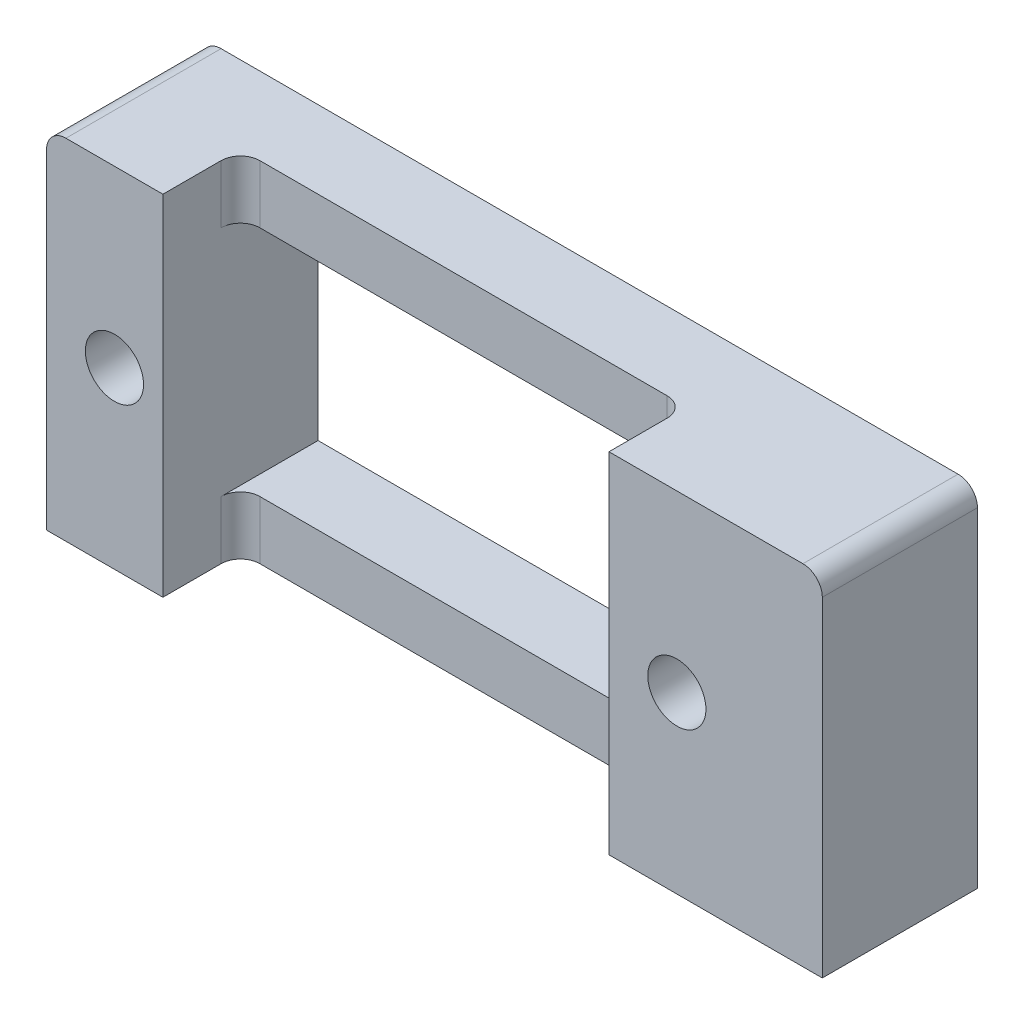
ISO-10303-21;
HEADER;
FILE_DESCRIPTION(('STEP AP214'),'2;1');
FILE_NAME('part.step','',(''),(''),'','','');
FILE_SCHEMA(('AUTOMOTIVE_DESIGN { 1 0 10303 214 1 1 1 1 }'));
ENDSEC;
DATA;
#1=APPLICATION_CONTEXT('core data for automotive mechanical design processes');
#2=APPLICATION_PROTOCOL_DEFINITION('international standard','automotive_design',2000,#1);
#3=PRODUCT_CONTEXT('',#1,'mechanical');
#4=PRODUCT('Part','Part','',(#3));
#5=PRODUCT_RELATED_PRODUCT_CATEGORY('part','',(#4));
#6=PRODUCT_DEFINITION_FORMATION('','',#4);
#7=PRODUCT_DEFINITION_CONTEXT('part definition',#1,'design');
#8=PRODUCT_DEFINITION('design','',#6,#7);
#9=PRODUCT_DEFINITION_SHAPE('','',#8);
#10=(LENGTH_UNIT() NAMED_UNIT(*) SI_UNIT(.MILLI.,.METRE.));
#11=(NAMED_UNIT(*) PLANE_ANGLE_UNIT() SI_UNIT($,.RADIAN.));
#12=(NAMED_UNIT(*) SI_UNIT($,.STERADIAN.) SOLID_ANGLE_UNIT());
#13=UNCERTAINTY_MEASURE_WITH_UNIT(LENGTH_MEASURE(1.E-05),#10,'distance_accuracy_value','');
#14=(GEOMETRIC_REPRESENTATION_CONTEXT(3) GLOBAL_UNCERTAINTY_ASSIGNED_CONTEXT((#13)) GLOBAL_UNIT_ASSIGNED_CONTEXT((#10,
#11,#12)) REPRESENTATION_CONTEXT('',''));
#15=CARTESIAN_POINT('',(0.,0.,0.));
#16=DIRECTION('',(0.,0.,1.));
#17=DIRECTION('',(1.,0.,0.));
#18=AXIS2_PLACEMENT_3D('',#15,#16,#17);
#19=CARTESIAN_POINT('',(0.,-5.39673913043478,-8.));
#20=DIRECTION('',(0.,-1.,0.));
#21=DIRECTION('',(0.,0.,-1.));
#22=AXIS2_PLACEMENT_3D('',#19,#20,#21);
#23=PLANE('',#22);
#24=DIRECTION('',(-1.,0.,0.));
#25=VECTOR('',#24,1.);
#26=CARTESIAN_POINT('',(-9.92391304347827,-5.39673913043478,-4.));
#27=LINE('',#26,#25);
#28=CARTESIAN_POINT('',(12.0760869565217,-5.39673913043478,-4.));
#29=VERTEX_POINT('',#28);
#30=CARTESIAN_POINT('',(-8.92391304347827,-5.39673913043478,-4.));
#31=VERTEX_POINT('',#30);
#32=EDGE_CURVE('E397',#29,#31,#27,.T.);
#33=ORIENTED_EDGE('',*,*,#32,.F.);
#34=CARTESIAN_POINT('',(12.0760869565217,-5.39673913043478,-3.));
#35=DIRECTION('',(0.,-1.,0.));
#36=DIRECTION('',(0.,0.,-1.));
#37=AXIS2_PLACEMENT_3D('',#34,#35,#36);
#38=CIRCLE('',#37,1.);
#39=CARTESIAN_POINT('',(13.0760869565217,-5.39673913043478,-3.));
#40=VERTEX_POINT('',#39);
#41=EDGE_CURVE('E256',#29,#40,#38,.T.);
#42=ORIENTED_EDGE('',*,*,#41,.T.);
#43=DIRECTION('',(0.,0.,1.));
#44=VECTOR('',#43,1.);
#45=CARTESIAN_POINT('',(13.0760869565217,-5.39673913043478,-8.));
#46=LINE('',#45,#44);
#47=CARTESIAN_POINT('',(13.0760869565217,-5.39673913043478,-8.));
#48=VERTEX_POINT('',#47);
#49=EDGE_CURVE('E215',#48,#40,#46,.T.);
#50=ORIENTED_EDGE('',*,*,#49,.F.);
#51=DIRECTION('',(1.,0.,0.));
#52=VECTOR('',#51,1.);
#53=CARTESIAN_POINT('',(0.,-5.39673913043478,-8.));
#54=LINE('',#53,#52);
#55=CARTESIAN_POINT('',(-9.92391304347827,-5.39673913043478,-8.));
#56=VERTEX_POINT('',#55);
#57=EDGE_CURVE('E328',#56,#48,#54,.T.);
#58=ORIENTED_EDGE('',*,*,#57,.F.);
#59=DIRECTION('',(0.,0.,1.));
#60=VECTOR('',#59,1.);
#61=CARTESIAN_POINT('',(-9.92391304347827,-5.39673913043478,-8.));
#62=LINE('',#61,#60);
#63=CARTESIAN_POINT('',(-9.92391304347827,-5.39673913043478,-3.));
#64=VERTEX_POINT('',#63);
#65=EDGE_CURVE('E224',#56,#64,#62,.T.);
#66=ORIENTED_EDGE('',*,*,#65,.T.);
#67=CARTESIAN_POINT('',(-8.92391304347827,-5.39673913043478,-3.));
#68=DIRECTION('',(0.,-1.,0.));
#69=DIRECTION('',(0.,0.,-1.));
#70=AXIS2_PLACEMENT_3D('',#67,#68,#69);
#71=CIRCLE('',#70,1.);
#72=EDGE_CURVE('E278',#64,#31,#71,.T.);
#73=ORIENTED_EDGE('',*,*,#72,.T.);
#74=EDGE_LOOP('',(#33,#42,#50,#58,#66,#73));
#75=FACE_BOUND('',#74,.T.);
#76=ADVANCED_FACE('F41',(#75),#23,.F.);
#77=CARTESIAN_POINT('',(0.,0.,0.));
#78=DIRECTION('',(0.,0.,1.));
#79=DIRECTION('',(1.,0.,0.));
#80=AXIS2_PLACEMENT_3D('',#77,#78,#79);
#81=PLANE('',#80);
#82=DIRECTION('',(1.,0.,0.));
#83=VECTOR('',#82,1.);
#84=CARTESIAN_POINT('',(0.,9.60326086956522,0.));
#85=LINE('',#84,#83);
#86=CARTESIAN_POINT('',(-14.9239130434783,9.60326086956522,0.));
#87=VERTEX_POINT('',#86);
#88=CARTESIAN_POINT('',(-9.92391304347827,9.60326086956522,0.));
#89=VERTEX_POINT('',#88);
#90=EDGE_CURVE('E196',#87,#89,#85,.T.);
#91=ORIENTED_EDGE('',*,*,#90,.F.);
#92=CARTESIAN_POINT('',(-14.9239130434783,8.60326086956522,0.));
#93=DIRECTION('',(0.,0.,1.));
#94=DIRECTION('',(1.,0.,0.));
#95=AXIS2_PLACEMENT_3D('',#92,#93,#94);
#96=CIRCLE('',#95,1.);
#97=CARTESIAN_POINT('',(-15.9239130434783,8.60326086956522,0.));
#98=VERTEX_POINT('',#97);
#99=EDGE_CURVE('E50',#87,#98,#96,.T.);
#100=ORIENTED_EDGE('',*,*,#99,.T.);
#101=DIRECTION('',(0.,-1.,0.));
#102=VECTOR('',#101,1.);
#103=CARTESIAN_POINT('',(-15.9239130434783,0.,0.));
#104=LINE('',#103,#102);
#105=CARTESIAN_POINT('',(-15.9239130434783,-8.39673913043478,0.));
#106=VERTEX_POINT('',#105);
#107=EDGE_CURVE('E351',#98,#106,#104,.T.);
#108=ORIENTED_EDGE('',*,*,#107,.T.);
#109=DIRECTION('',(1.,0.,0.));
#110=VECTOR('',#109,1.);
#111=CARTESIAN_POINT('',(0.,-8.39673913043478,0.));
#112=LINE('',#111,#110);
#113=CARTESIAN_POINT('',(-9.92391304347827,-8.39673913043478,0.));
#114=VERTEX_POINT('',#113);
#115=EDGE_CURVE('E202',#106,#114,#112,.T.);
#116=ORIENTED_EDGE('',*,*,#115,.T.);
#117=DIRECTION('',(0.,1.,0.));
#118=VECTOR('',#117,1.);
#119=CARTESIAN_POINT('',(-9.92391304347827,0.,0.));
#120=LINE('',#119,#118);
#121=EDGE_CURVE('E189',#114,#89,#120,.T.);
#122=ORIENTED_EDGE('',*,*,#121,.T.);
#123=EDGE_LOOP('',(#91,#100,#108,#116,#122));
#124=FACE_BOUND('',#123,.T.);
#125=CARTESIAN_POINT('',(-12.4239130434783,0.603260869565216,0.));
#126=DIRECTION('',(0.,0.,1.));
#127=DIRECTION('',(1.,0.,0.));
#128=AXIS2_PLACEMENT_3D('',#125,#126,#127);
#129=CIRCLE('',#128,1.5);
#130=CARTESIAN_POINT('',(-10.9239130434783,0.603260869565216,0.));
#131=VERTEX_POINT('',#130);
#132=EDGE_CURVE('E341',#131,#131,#129,.T.);
#133=ORIENTED_EDGE('',*,*,#132,.F.);
#134=EDGE_LOOP('',(#133));
#135=FACE_BOUND('',#134,.T.);
#136=ADVANCED_FACE('F379',(#124,#135),#81,.T.);
#137=CARTESIAN_POINT('',(-15.9239130434783,0.,-8.));
#138=DIRECTION('',(-1.,0.,0.));
#139=DIRECTION('',(0.,0.,1.));
#140=AXIS2_PLACEMENT_3D('',#137,#138,#139);
#141=PLANE('',#140);
#142=ORIENTED_EDGE('',*,*,#107,.F.);
#143=DIRECTION('',(0.,0.,1.));
#144=VECTOR('',#143,1.);
#145=CARTESIAN_POINT('',(-15.9239130434783,8.60326086956522,-8.));
#146=LINE('',#145,#144);
#147=CARTESIAN_POINT('',(-15.9239130434783,8.60326086956522,-8.));
#148=VERTEX_POINT('',#147);
#149=EDGE_CURVE('E11',#98,#148,#146,.F.);
#150=ORIENTED_EDGE('',*,*,#149,.T.);
#151=DIRECTION('',(0.,-1.,0.));
#152=VECTOR('',#151,1.);
#153=CARTESIAN_POINT('',(-15.9239130434783,0.,-8.));
#154=LINE('',#153,#152);
#155=CARTESIAN_POINT('',(-15.9239130434783,-8.39673913043478,-8.));
#156=VERTEX_POINT('',#155);
#157=EDGE_CURVE('E310',#148,#156,#154,.T.);
#158=ORIENTED_EDGE('',*,*,#157,.T.);
#159=DIRECTION('',(0.,0.,1.));
#160=VECTOR('',#159,1.);
#161=CARTESIAN_POINT('',(-15.9239130434783,-8.39673913043478,-8.));
#162=LINE('',#161,#160);
#163=EDGE_CURVE('E211',#156,#106,#162,.T.);
#164=ORIENTED_EDGE('',*,*,#163,.T.);
#165=EDGE_LOOP('',(#142,#150,#158,#164));
#166=FACE_BOUND('',#165,.T.);
#167=ADVANCED_FACE('F453',(#166),#141,.T.);
#168=CARTESIAN_POINT('',(0.,9.60326086956522,-8.));
#169=DIRECTION('',(0.,-1.,0.));
#170=DIRECTION('',(0.,0.,-1.));
#171=AXIS2_PLACEMENT_3D('',#168,#169,#170);
#172=PLANE('',#171);
#173=CARTESIAN_POINT('',(13.0760869565217,9.60326086956522,0.));
#174=VERTEX_POINT('',#173);
#175=CARTESIAN_POINT('',(23.0760869565217,9.60326086956522,0.));
#176=VERTEX_POINT('',#175);
#177=EDGE_CURVE('E168',#174,#176,#85,.T.);
#178=ORIENTED_EDGE('',*,*,#177,.T.);
#179=DIRECTION('',(0.,0.,1.));
#180=VECTOR('',#179,1.);
#181=CARTESIAN_POINT('',(23.0760869565217,9.60326086956522,-8.));
#182=LINE('',#181,#180);
#183=CARTESIAN_POINT('',(23.0760869565217,9.60326086956522,-8.));
#184=VERTEX_POINT('',#183);
#185=EDGE_CURVE('E291',#176,#184,#182,.F.);
#186=ORIENTED_EDGE('',*,*,#185,.T.);
#187=DIRECTION('',(1.,0.,0.));
#188=VECTOR('',#187,1.);
#189=CARTESIAN_POINT('',(0.,9.60326086956522,-8.));
#190=LINE('',#189,#188);
#191=CARTESIAN_POINT('',(-14.9239130434783,9.60326086956522,-8.));
#192=VERTEX_POINT('',#191);
#193=EDGE_CURVE('E227',#192,#184,#190,.T.);
#194=ORIENTED_EDGE('',*,*,#193,.F.);
#195=DIRECTION('',(0.,0.,1.));
#196=VECTOR('',#195,1.);
#197=CARTESIAN_POINT('',(-14.9239130434783,9.60326086956522,0.));
#198=LINE('',#197,#196);
#199=EDGE_CURVE('E287',#192,#87,#198,.T.);
#200=ORIENTED_EDGE('',*,*,#199,.T.);
#201=ORIENTED_EDGE('',*,*,#90,.T.);
#202=DIRECTION('',(0.,0.,1.));
#203=VECTOR('',#202,1.);
#204=CARTESIAN_POINT('',(-9.92391304347827,9.60326086956522,-4.));
#205=LINE('',#204,#203);
#206=CARTESIAN_POINT('',(-9.92391304347827,9.60326086956522,-3.));
#207=VERTEX_POINT('',#206);
#208=EDGE_CURVE('E176',#207,#89,#205,.T.);
#209=ORIENTED_EDGE('',*,*,#208,.F.);
#210=CARTESIAN_POINT('',(-8.92391304347827,9.60326086956522,-3.));
#211=DIRECTION('',(0.,-1.,0.));
#212=DIRECTION('',(0.,0.,-1.));
#213=AXIS2_PLACEMENT_3D('',#210,#211,#212);
#214=CIRCLE('',#213,1.);
#215=CARTESIAN_POINT('',(-8.92391304347827,9.60326086956522,-4.));
#216=VERTEX_POINT('',#215);
#217=EDGE_CURVE('E272',#207,#216,#214,.T.);
#218=ORIENTED_EDGE('',*,*,#217,.T.);
#219=DIRECTION('',(-1.,0.,0.));
#220=VECTOR('',#219,1.);
#221=CARTESIAN_POINT('',(-9.92391304347827,9.60326086956522,-4.));
#222=LINE('',#221,#220);
#223=CARTESIAN_POINT('',(12.0760869565217,9.60326086956522,-4.));
#224=VERTEX_POINT('',#223);
#225=EDGE_CURVE('E177',#224,#216,#222,.T.);
#226=ORIENTED_EDGE('',*,*,#225,.F.);
#227=CARTESIAN_POINT('',(12.0760869565217,9.60326086956522,-3.));
#228=DIRECTION('',(0.,-1.,0.));
#229=DIRECTION('',(0.,0.,-1.));
#230=AXIS2_PLACEMENT_3D('',#227,#228,#229);
#231=CIRCLE('',#230,1.);
#232=CARTESIAN_POINT('',(13.0760869565217,9.60326086956522,-3.));
#233=VERTEX_POINT('',#232);
#234=EDGE_CURVE('E171',#224,#233,#231,.T.);
#235=ORIENTED_EDGE('',*,*,#234,.T.);
#236=DIRECTION('',(0.,0.,1.));
#237=VECTOR('',#236,1.);
#238=CARTESIAN_POINT('',(13.0760869565217,9.60326086956522,-4.));
#239=LINE('',#238,#237);
#240=EDGE_CURVE('E164',#233,#174,#239,.T.);
#241=ORIENTED_EDGE('',*,*,#240,.T.);
#242=EDGE_LOOP('',(#178,#186,#194,#200,#201,#209,#218,#226,#235,#241));
#243=FACE_BOUND('',#242,.T.);
#244=ADVANCED_FACE('F166',(#243),#172,.F.);
#245=CARTESIAN_POINT('',(24.0760869565217,0.,-8.));
#246=DIRECTION('',(-1.,0.,0.));
#247=DIRECTION('',(0.,0.,1.));
#248=AXIS2_PLACEMENT_3D('',#245,#246,#247);
#249=PLANE('',#248);
#250=DIRECTION('',(0.,-1.,0.));
#251=VECTOR('',#250,1.);
#252=CARTESIAN_POINT('',(24.0760869565217,0.,-8.));
#253=LINE('',#252,#251);
#254=CARTESIAN_POINT('',(24.0760869565217,8.60326086956522,-8.));
#255=VERTEX_POINT('',#254);
#256=CARTESIAN_POINT('',(24.0760869565217,-8.39673913043478,-8.));
#257=VERTEX_POINT('',#256);
#258=EDGE_CURVE('E303',#255,#257,#253,.T.);
#259=ORIENTED_EDGE('',*,*,#258,.F.);
#260=DIRECTION('',(0.,0.,1.));
#261=VECTOR('',#260,1.);
#262=CARTESIAN_POINT('',(24.0760869565217,8.60326086956522,-8.));
#263=LINE('',#262,#261);
#264=CARTESIAN_POINT('',(24.0760869565217,8.60326086956522,0.));
#265=VERTEX_POINT('',#264);
#266=EDGE_CURVE('E281',#255,#265,#263,.T.);
#267=ORIENTED_EDGE('',*,*,#266,.T.);
#268=DIRECTION('',(0.,-1.,0.));
#269=VECTOR('',#268,1.);
#270=CARTESIAN_POINT('',(24.0760869565217,0.,0.));
#271=LINE('',#270,#269);
#272=CARTESIAN_POINT('',(24.0760869565217,-8.39673913043478,0.));
#273=VERTEX_POINT('',#272);
#274=EDGE_CURVE('E197',#265,#273,#271,.T.);
#275=ORIENTED_EDGE('',*,*,#274,.T.);
#276=DIRECTION('',(0.,0.,1.));
#277=VECTOR('',#276,1.);
#278=CARTESIAN_POINT('',(24.0760869565217,-8.39673913043478,-8.));
#279=LINE('',#278,#277);
#280=EDGE_CURVE('E206',#257,#273,#279,.T.);
#281=ORIENTED_EDGE('',*,*,#280,.F.);
#282=EDGE_LOOP('',(#259,#267,#275,#281));
#283=FACE_BOUND('',#282,.T.);
#284=ADVANCED_FACE('F366',(#283),#249,.F.);
#285=CARTESIAN_POINT('',(13.0760869565217,0.,-8.));
#286=DIRECTION('',(1.,0.,0.));
#287=DIRECTION('',(0.,1.,0.));
#288=AXIS2_PLACEMENT_3D('',#285,#286,#287);
#289=PLANE('',#288);
#290=ORIENTED_EDGE('',*,*,#49,.T.);
#291=DIRECTION('',(0.,1.,0.));
#292=VECTOR('',#291,1.);
#293=CARTESIAN_POINT('',(13.0760869565217,0.,-3.));
#294=LINE('',#293,#292);
#295=CARTESIAN_POINT('',(13.0760869565217,-8.39673913043478,-3.));
#296=VERTEX_POINT('',#295);
#297=EDGE_CURVE('E238',#40,#296,#294,.F.);
#298=ORIENTED_EDGE('',*,*,#297,.T.);
#299=DIRECTION('',(0.,0.,1.));
#300=VECTOR('',#299,1.);
#301=CARTESIAN_POINT('',(13.0760869565217,-8.39673913043478,-4.));
#302=LINE('',#301,#300);
#303=CARTESIAN_POINT('',(13.0760869565217,-8.39673913043478,0.));
#304=VERTEX_POINT('',#303);
#305=EDGE_CURVE('E183',#296,#304,#302,.T.);
#306=ORIENTED_EDGE('',*,*,#305,.T.);
#307=DIRECTION('',(0.,1.,0.));
#308=VECTOR('',#307,1.);
#309=CARTESIAN_POINT('',(13.0760869565217,0.,0.));
#310=LINE('',#309,#308);
#311=EDGE_CURVE('E180',#304,#174,#310,.T.);
#312=ORIENTED_EDGE('',*,*,#311,.T.);
#313=ORIENTED_EDGE('',*,*,#240,.F.);
#314=DIRECTION('',(0.,1.,0.));
#315=VECTOR('',#314,1.);
#316=CARTESIAN_POINT('',(13.0760869565217,6.60326086956522,-3.));
#317=LINE('',#316,#315);
#318=CARTESIAN_POINT('',(13.0760869565217,6.60326086956522,-3.));
#319=VERTEX_POINT('',#318);
#320=EDGE_CURVE('E235',#233,#319,#317,.F.);
#321=ORIENTED_EDGE('',*,*,#320,.T.);
#322=DIRECTION('',(0.,0.,1.));
#323=VECTOR('',#322,1.);
#324=CARTESIAN_POINT('',(13.0760869565217,6.60326086956522,-8.));
#325=LINE('',#324,#323);
#326=CARTESIAN_POINT('',(13.0760869565217,6.60326086956522,-8.));
#327=VERTEX_POINT('',#326);
#328=EDGE_CURVE('E218',#327,#319,#325,.T.);
#329=ORIENTED_EDGE('',*,*,#328,.F.);
#330=DIRECTION('',(0.,1.,0.));
#331=VECTOR('',#330,1.);
#332=CARTESIAN_POINT('',(13.0760869565217,0.,-8.));
#333=LINE('',#332,#331);
#334=EDGE_CURVE('E317',#48,#327,#333,.T.);
#335=ORIENTED_EDGE('',*,*,#334,.F.);
#336=EDGE_LOOP('',(#290,#298,#306,#312,#313,#321,#329,#335));
#337=FACE_BOUND('',#336,.T.);
#338=ADVANCED_FACE('F181',(#337),#289,.F.);
#339=CARTESIAN_POINT('',(0.,6.60326086956522,-8.));
#340=DIRECTION('',(0.,-1.,0.));
#341=DIRECTION('',(1.,0.,0.));
#342=AXIS2_PLACEMENT_3D('',#339,#340,#341);
#343=PLANE('',#342);
#344=DIRECTION('',(1.,0.,0.));
#345=VECTOR('',#344,1.);
#346=CARTESIAN_POINT('',(-9.92391304347827,6.60326086956522,-4.));
#347=LINE('',#346,#345);
#348=CARTESIAN_POINT('',(-8.92391304347827,6.60326086956522,-4.));
#349=VERTEX_POINT('',#348);
#350=CARTESIAN_POINT('',(12.0760869565217,6.60326086956522,-4.));
#351=VERTEX_POINT('',#350);
#352=EDGE_CURVE('E401',#349,#351,#347,.T.);
#353=ORIENTED_EDGE('',*,*,#352,.F.);
#354=CARTESIAN_POINT('',(-8.92391304347827,6.60326086956522,-3.));
#355=DIRECTION('',(0.,-1.,0.));
#356=DIRECTION('',(1.,0.,0.));
#357=AXIS2_PLACEMENT_3D('',#354,#355,#356);
#358=CIRCLE('',#357,1.);
#359=CARTESIAN_POINT('',(-9.92391304347827,6.60326086956522,-3.));
#360=VERTEX_POINT('',#359);
#361=EDGE_CURVE('E268',#349,#360,#358,.F.);
#362=ORIENTED_EDGE('',*,*,#361,.T.);
#363=DIRECTION('',(0.,0.,1.));
#364=VECTOR('',#363,1.);
#365=CARTESIAN_POINT('',(-9.92391304347827,6.60326086956522,-8.));
#366=LINE('',#365,#364);
#367=CARTESIAN_POINT('',(-9.92391304347827,6.60326086956522,-8.));
#368=VERTEX_POINT('',#367);
#369=EDGE_CURVE('E221',#368,#360,#366,.T.);
#370=ORIENTED_EDGE('',*,*,#369,.F.);
#371=DIRECTION('',(1.,0.,0.));
#372=VECTOR('',#371,1.);
#373=CARTESIAN_POINT('',(0.,6.60326086956522,-8.));
#374=LINE('',#373,#372);
#375=EDGE_CURVE('E320',#368,#327,#374,.T.);
#376=ORIENTED_EDGE('',*,*,#375,.T.);
#377=ORIENTED_EDGE('',*,*,#328,.T.);
#378=CARTESIAN_POINT('',(12.0760869565217,6.60326086956522,-3.));
#379=DIRECTION('',(0.,-1.,0.));
#380=DIRECTION('',(1.,0.,0.));
#381=AXIS2_PLACEMENT_3D('',#378,#379,#380);
#382=CIRCLE('',#381,1.);
#383=EDGE_CURVE('E265',#319,#351,#382,.F.);
#384=ORIENTED_EDGE('',*,*,#383,.T.);
#385=EDGE_LOOP('',(#353,#362,#370,#376,#377,#384));
#386=FACE_BOUND('',#385,.T.);
#387=ADVANCED_FACE('F424',(#386),#343,.T.);
#388=CARTESIAN_POINT('',(16.5760869565217,0.603260869565216,-8.));
#389=DIRECTION('',(0.,0.,1.));
#390=DIRECTION('',(1.,0.,0.));
#391=AXIS2_PLACEMENT_3D('',#388,#389,#390);
#392=CYLINDRICAL_SURFACE('',#391,1.5);
#393=CARTESIAN_POINT('',(16.5760869565217,0.603260869565216,-8.));
#394=DIRECTION('',(0.,0.,1.));
#395=DIRECTION('',(1.,0.,0.));
#396=AXIS2_PLACEMENT_3D('',#393,#394,#395);
#397=CIRCLE('',#396,1.5);
#398=CARTESIAN_POINT('',(18.0760869565217,0.603260869565216,-8.));
#399=VERTEX_POINT('',#398);
#400=EDGE_CURVE('E313',#399,#399,#397,.T.);
#401=ORIENTED_EDGE('',*,*,#400,.F.);
#402=EDGE_LOOP('',(#401));
#403=FACE_BOUND('',#402,.T.);
#404=CARTESIAN_POINT('',(16.5760869565217,0.603260869565216,0.));
#405=DIRECTION('',(0.,0.,1.));
#406=DIRECTION('',(1.,0.,0.));
#407=AXIS2_PLACEMENT_3D('',#404,#405,#406);
#408=CIRCLE('',#407,1.5);
#409=CARTESIAN_POINT('',(18.0760869565217,0.603260869565216,0.));
#410=VERTEX_POINT('',#409);
#411=EDGE_CURVE('E188',#410,#410,#408,.T.);
#412=ORIENTED_EDGE('',*,*,#411,.T.);
#413=EDGE_LOOP('',(#412));
#414=FACE_BOUND('',#413,.T.);
#415=ADVANCED_FACE('F465',(#403,#414),#392,.F.);
#416=CARTESIAN_POINT('',(-9.92391304347827,0.,-8.));
#417=DIRECTION('',(1.,0.,0.));
#418=DIRECTION('',(0.,0.,-1.));
#419=AXIS2_PLACEMENT_3D('',#416,#417,#418);
#420=PLANE('',#419);
#421=ORIENTED_EDGE('',*,*,#369,.T.);
#422=DIRECTION('',(0.,-1.,0.));
#423=VECTOR('',#422,1.);
#424=CARTESIAN_POINT('',(-9.92391304347827,0.,-3.));
#425=LINE('',#424,#423);
#426=EDGE_CURVE('E253',#360,#207,#425,.F.);
#427=ORIENTED_EDGE('',*,*,#426,.T.);
#428=ORIENTED_EDGE('',*,*,#208,.T.);
#429=ORIENTED_EDGE('',*,*,#121,.F.);
#430=DIRECTION('',(0.,0.,1.));
#431=VECTOR('',#430,1.);
#432=CARTESIAN_POINT('',(-9.92391304347827,-8.39673913043478,-4.));
#433=LINE('',#432,#431);
#434=CARTESIAN_POINT('',(-9.92391304347827,-8.39673913043478,-3.));
#435=VERTEX_POINT('',#434);
#436=EDGE_CURVE('E338',#435,#114,#433,.T.);
#437=ORIENTED_EDGE('',*,*,#436,.F.);
#438=DIRECTION('',(0.,-1.,0.));
#439=VECTOR('',#438,1.);
#440=CARTESIAN_POINT('',(-9.92391304347827,-5.39673913043478,-3.));
#441=LINE('',#440,#439);
#442=EDGE_CURVE('E249',#435,#64,#441,.F.);
#443=ORIENTED_EDGE('',*,*,#442,.T.);
#444=ORIENTED_EDGE('',*,*,#65,.F.);
#445=DIRECTION('',(0.,1.,0.));
#446=VECTOR('',#445,1.);
#447=CARTESIAN_POINT('',(-9.92391304347827,0.,-8.));
#448=LINE('',#447,#446);
#449=EDGE_CURVE('E324',#56,#368,#448,.T.);
#450=ORIENTED_EDGE('',*,*,#449,.T.);
#451=EDGE_LOOP('',(#421,#427,#428,#429,#437,#443,#444,#450));
#452=FACE_BOUND('',#451,.T.);
#453=ADVANCED_FACE('F384',(#452),#420,.T.);
#454=CARTESIAN_POINT('',(-12.4239130434783,0.603260869565216,-8.));
#455=DIRECTION('',(0.,0.,1.));
#456=DIRECTION('',(1.,0.,0.));
#457=AXIS2_PLACEMENT_3D('',#454,#455,#456);
#458=CYLINDRICAL_SURFACE('',#457,1.5);
#459=CARTESIAN_POINT('',(-12.4239130434783,0.603260869565216,-8.));
#460=DIRECTION('',(0.,0.,1.));
#461=DIRECTION('',(1.,0.,0.));
#462=AXIS2_PLACEMENT_3D('',#459,#460,#461);
#463=CIRCLE('',#462,1.5);
#464=CARTESIAN_POINT('',(-10.9239130434783,0.603260869565216,-8.));
#465=VERTEX_POINT('',#464);
#466=EDGE_CURVE('E201',#465,#465,#463,.T.);
#467=ORIENTED_EDGE('',*,*,#466,.F.);
#468=EDGE_LOOP('',(#467));
#469=FACE_BOUND('',#468,.T.);
#470=ORIENTED_EDGE('',*,*,#132,.T.);
#471=EDGE_LOOP('',(#470));
#472=FACE_BOUND('',#471,.T.);
#473=ADVANCED_FACE('F457',(#469,#472),#458,.F.);
#474=CARTESIAN_POINT('',(0.,-8.39673913043478,-8.));
#475=DIRECTION('',(0.,-1.,0.));
#476=DIRECTION('',(1.,0.,0.));
#477=AXIS2_PLACEMENT_3D('',#474,#475,#476);
#478=PLANE('',#477);
#479=DIRECTION('',(1.,0.,0.));
#480=VECTOR('',#479,1.);
#481=CARTESIAN_POINT('',(-9.92391304347827,-8.39673913043478,-4.));
#482=LINE('',#481,#480);
#483=CARTESIAN_POINT('',(-8.92391304347827,-8.39673913043478,-4.));
#484=VERTEX_POINT('',#483);
#485=CARTESIAN_POINT('',(12.0760869565217,-8.39673913043478,-4.));
#486=VERTEX_POINT('',#485);
#487=EDGE_CURVE('E393',#484,#486,#482,.T.);
#488=ORIENTED_EDGE('',*,*,#487,.F.);
#489=CARTESIAN_POINT('',(-8.92391304347827,-8.39673913043478,-3.));
#490=DIRECTION('',(0.,-1.,0.));
#491=DIRECTION('',(1.,0.,0.));
#492=AXIS2_PLACEMENT_3D('',#489,#490,#491);
#493=CIRCLE('',#492,1.);
#494=EDGE_CURVE('E275',#484,#435,#493,.F.);
#495=ORIENTED_EDGE('',*,*,#494,.T.);
#496=ORIENTED_EDGE('',*,*,#436,.T.);
#497=ORIENTED_EDGE('',*,*,#115,.F.);
#498=ORIENTED_EDGE('',*,*,#163,.F.);
#499=DIRECTION('',(1.,0.,0.));
#500=VECTOR('',#499,1.);
#501=CARTESIAN_POINT('',(0.,-8.39673913043478,-8.));
#502=LINE('',#501,#500);
#503=EDGE_CURVE('E306',#156,#257,#502,.T.);
#504=ORIENTED_EDGE('',*,*,#503,.T.);
#505=ORIENTED_EDGE('',*,*,#280,.T.);
#506=EDGE_CURVE('E353',#304,#273,#112,.T.);
#507=ORIENTED_EDGE('',*,*,#506,.F.);
#508=ORIENTED_EDGE('',*,*,#305,.F.);
#509=CARTESIAN_POINT('',(12.0760869565217,-8.39673913043478,-3.));
#510=DIRECTION('',(0.,-1.,0.));
#511=DIRECTION('',(1.,0.,0.));
#512=AXIS2_PLACEMENT_3D('',#509,#510,#511);
#513=CIRCLE('',#512,1.);
#514=EDGE_CURVE('E260',#296,#486,#513,.F.);
#515=ORIENTED_EDGE('',*,*,#514,.T.);
#516=EDGE_LOOP('',(#488,#495,#496,#497,#498,#504,#505,#507,#508,#515));
#517=FACE_BOUND('',#516,.T.);
#518=ADVANCED_FACE('F361',(#517),#478,.T.);
#519=CARTESIAN_POINT('',(0.,0.,-8.));
#520=DIRECTION('',(0.,0.,1.));
#521=DIRECTION('',(1.,0.,0.));
#522=AXIS2_PLACEMENT_3D('',#519,#520,#521);
#523=PLANE('',#522);
#524=ORIENTED_EDGE('',*,*,#466,.T.);
#525=EDGE_LOOP('',(#524));
#526=FACE_BOUND('',#525,.T.);
#527=ORIENTED_EDGE('',*,*,#57,.T.);
#528=ORIENTED_EDGE('',*,*,#334,.T.);
#529=ORIENTED_EDGE('',*,*,#375,.F.);
#530=ORIENTED_EDGE('',*,*,#449,.F.);
#531=EDGE_LOOP('',(#527,#528,#529,#530));
#532=FACE_BOUND('',#531,.T.);
#533=ORIENTED_EDGE('',*,*,#400,.T.);
#534=EDGE_LOOP('',(#533));
#535=FACE_BOUND('',#534,.T.);
#536=ORIENTED_EDGE('',*,*,#193,.T.);
#537=CARTESIAN_POINT('',(23.0760869565217,8.60326086956522,-8.));
#538=DIRECTION('',(0.,0.,1.));
#539=DIRECTION('',(1.,0.,0.));
#540=AXIS2_PLACEMENT_3D('',#537,#538,#539);
#541=CIRCLE('',#540,1.);
#542=EDGE_CURVE('E297',#184,#255,#541,.F.);
#543=ORIENTED_EDGE('',*,*,#542,.T.);
#544=ORIENTED_EDGE('',*,*,#258,.T.);
#545=ORIENTED_EDGE('',*,*,#503,.F.);
#546=ORIENTED_EDGE('',*,*,#157,.F.);
#547=CARTESIAN_POINT('',(-14.9239130434783,8.60326086956522,-8.));
#548=DIRECTION('',(0.,0.,1.));
#549=DIRECTION('',(1.,0.,0.));
#550=AXIS2_PLACEMENT_3D('',#547,#548,#549);
#551=CIRCLE('',#550,1.);
#552=EDGE_CURVE('E294',#148,#192,#551,.F.);
#553=ORIENTED_EDGE('',*,*,#552,.T.);
#554=EDGE_LOOP('',(#536,#543,#544,#545,#546,#553));
#555=FACE_BOUND('',#554,.T.);
#556=ADVANCED_FACE('F374',(#526,#532,#535,#555),#523,.F.);
#557=ORIENTED_EDGE('',*,*,#274,.F.);
#558=CARTESIAN_POINT('',(23.0760869565217,8.60326086956522,0.));
#559=DIRECTION('',(0.,0.,1.));
#560=DIRECTION('',(1.,0.,0.));
#561=AXIS2_PLACEMENT_3D('',#558,#559,#560);
#562=CIRCLE('',#561,1.);
#563=EDGE_CURVE('E194',#265,#176,#562,.T.);
#564=ORIENTED_EDGE('',*,*,#563,.T.);
#565=ORIENTED_EDGE('',*,*,#177,.F.);
#566=ORIENTED_EDGE('',*,*,#311,.F.);
#567=ORIENTED_EDGE('',*,*,#506,.T.);
#568=EDGE_LOOP('',(#557,#564,#565,#566,#567));
#569=FACE_BOUND('',#568,.T.);
#570=ORIENTED_EDGE('',*,*,#411,.F.);
#571=EDGE_LOOP('',(#570));
#572=FACE_BOUND('',#571,.T.);
#573=ADVANCED_FACE('F192',(#569,#572),#81,.T.);
#574=CARTESIAN_POINT('',(0.,0.,-4.));
#575=DIRECTION('',(0.,0.,1.));
#576=DIRECTION('',(1.,0.,0.));
#577=AXIS2_PLACEMENT_3D('',#574,#575,#576);
#578=PLANE('',#577);
#579=ORIENTED_EDGE('',*,*,#487,.T.);
#580=DIRECTION('',(0.,1.,0.));
#581=VECTOR('',#580,1.);
#582=CARTESIAN_POINT('',(12.0760869565217,0.,-4.));
#583=LINE('',#582,#581);
#584=EDGE_CURVE('E231',#486,#29,#583,.T.);
#585=ORIENTED_EDGE('',*,*,#584,.T.);
#586=ORIENTED_EDGE('',*,*,#32,.T.);
#587=DIRECTION('',(0.,-1.,0.));
#588=VECTOR('',#587,1.);
#589=CARTESIAN_POINT('',(-8.92391304347827,-8.39673913043478,-4.));
#590=LINE('',#589,#588);
#591=EDGE_CURVE('E210',#31,#484,#590,.T.);
#592=ORIENTED_EDGE('',*,*,#591,.T.);
#593=EDGE_LOOP('',(#579,#585,#586,#592));
#594=FACE_BOUND('',#593,.T.);
#595=ADVANCED_FACE('F410',(#594),#578,.T.);
#596=CARTESIAN_POINT('',(0.,0.,-4.));
#597=DIRECTION('',(0.,0.,-1.));
#598=DIRECTION('',(-1.,0.,0.));
#599=AXIS2_PLACEMENT_3D('',#596,#597,#598);
#600=PLANE('',#599);
#601=ORIENTED_EDGE('',*,*,#352,.T.);
#602=DIRECTION('',(0.,1.,0.));
#603=VECTOR('',#602,1.);
#604=CARTESIAN_POINT('',(12.0760869565217,9.60326086956522,-4.));
#605=LINE('',#604,#603);
#606=EDGE_CURVE('E245',#351,#224,#605,.T.);
#607=ORIENTED_EDGE('',*,*,#606,.T.);
#608=ORIENTED_EDGE('',*,*,#225,.T.);
#609=DIRECTION('',(0.,-1.,0.));
#610=VECTOR('',#609,1.);
#611=CARTESIAN_POINT('',(-8.92391304347827,0.,-4.));
#612=LINE('',#611,#610);
#613=EDGE_CURVE('E241',#216,#349,#612,.T.);
#614=ORIENTED_EDGE('',*,*,#613,.T.);
#615=EDGE_LOOP('',(#601,#607,#608,#614));
#616=FACE_BOUND('',#615,.T.);
#617=ADVANCED_FACE('F430',(#616),#600,.F.);
#618=CARTESIAN_POINT('',(12.0760869565217,0.,-3.));
#619=DIRECTION('',(0.,1.,0.));
#620=DIRECTION('',(-1.,0.,0.));
#621=AXIS2_PLACEMENT_3D('',#618,#619,#620);
#622=CYLINDRICAL_SURFACE('',#621,1.);
#623=ORIENTED_EDGE('',*,*,#514,.F.);
#624=ORIENTED_EDGE('',*,*,#297,.F.);
#625=ORIENTED_EDGE('',*,*,#41,.F.);
#626=ORIENTED_EDGE('',*,*,#584,.F.);
#627=EDGE_LOOP('',(#623,#624,#625,#626));
#628=FACE_BOUND('',#627,.T.);
#629=ADVANCED_FACE('F438',(#628),#622,.F.);
#630=CARTESIAN_POINT('',(12.0760869565217,0.,-3.));
#631=DIRECTION('',(0.,-1.,0.));
#632=DIRECTION('',(1.,0.,0.));
#633=AXIS2_PLACEMENT_3D('',#630,#631,#632);
#634=CYLINDRICAL_SURFACE('',#633,1.);
#635=ORIENTED_EDGE('',*,*,#383,.F.);
#636=ORIENTED_EDGE('',*,*,#320,.F.);
#637=ORIENTED_EDGE('',*,*,#234,.F.);
#638=ORIENTED_EDGE('',*,*,#606,.F.);
#639=EDGE_LOOP('',(#635,#636,#637,#638));
#640=FACE_BOUND('',#639,.T.);
#641=ADVANCED_FACE('F435',(#640),#634,.F.);
#642=CARTESIAN_POINT('',(-8.92391304347827,0.,-3.));
#643=DIRECTION('',(0.,-1.,0.));
#644=DIRECTION('',(0.,0.,-1.));
#645=AXIS2_PLACEMENT_3D('',#642,#643,#644);
#646=CYLINDRICAL_SURFACE('',#645,1.);
#647=ORIENTED_EDGE('',*,*,#217,.F.);
#648=ORIENTED_EDGE('',*,*,#426,.F.);
#649=ORIENTED_EDGE('',*,*,#361,.F.);
#650=ORIENTED_EDGE('',*,*,#613,.F.);
#651=EDGE_LOOP('',(#647,#648,#649,#650));
#652=FACE_BOUND('',#651,.T.);
#653=ADVANCED_FACE('F427',(#652),#646,.F.);
#654=CARTESIAN_POINT('',(-8.92391304347827,0.,-3.));
#655=DIRECTION('',(0.,1.,0.));
#656=DIRECTION('',(0.,0.,1.));
#657=AXIS2_PLACEMENT_3D('',#654,#655,#656);
#658=CYLINDRICAL_SURFACE('',#657,1.);
#659=ORIENTED_EDGE('',*,*,#72,.F.);
#660=ORIENTED_EDGE('',*,*,#442,.F.);
#661=ORIENTED_EDGE('',*,*,#494,.F.);
#662=ORIENTED_EDGE('',*,*,#591,.F.);
#663=EDGE_LOOP('',(#659,#660,#661,#662));
#664=FACE_BOUND('',#663,.T.);
#665=ADVANCED_FACE('F408',(#664),#658,.F.);
#666=CARTESIAN_POINT('',(23.0760869565217,8.60326086956522,-8.));
#667=DIRECTION('',(0.,0.,1.));
#668=DIRECTION('',(1.,0.,0.));
#669=AXIS2_PLACEMENT_3D('',#666,#667,#668);
#670=CYLINDRICAL_SURFACE('',#669,1.);
#671=ORIENTED_EDGE('',*,*,#542,.F.);
#672=ORIENTED_EDGE('',*,*,#185,.F.);
#673=ORIENTED_EDGE('',*,*,#563,.F.);
#674=ORIENTED_EDGE('',*,*,#266,.F.);
#675=EDGE_LOOP('',(#671,#672,#673,#674));
#676=FACE_BOUND('',#675,.T.);
#677=ADVANCED_FACE('F370',(#676),#670,.T.);
#678=CARTESIAN_POINT('',(-14.9239130434783,8.60326086956522,-8.));
#679=DIRECTION('',(0.,0.,-1.));
#680=DIRECTION('',(-1.,0.,0.));
#681=AXIS2_PLACEMENT_3D('',#678,#679,#680);
#682=CYLINDRICAL_SURFACE('',#681,1.);
#683=ORIENTED_EDGE('',*,*,#552,.F.);
#684=ORIENTED_EDGE('',*,*,#149,.F.);
#685=ORIENTED_EDGE('',*,*,#99,.F.);
#686=ORIENTED_EDGE('',*,*,#199,.F.);
#687=EDGE_LOOP('',(#683,#684,#685,#686));
#688=FACE_BOUND('',#687,.T.);
#689=ADVANCED_FACE('F43',(#688),#682,.T.);
#690=CLOSED_SHELL('',(#76,#136,#167,#244,#284,#338,#387,#415,#453,#473,#518,#556,#573,#595,#617,
#629,#641,#653,#665,#677,#689));
#691=MANIFOLD_SOLID_BREP('B2',#690);
#692=ADVANCED_BREP_SHAPE_REPRESENTATION('',(#18,#691),#14);
#693=SHAPE_DEFINITION_REPRESENTATION(#9,#692);
ENDSEC;
END-ISO-10303-21;
